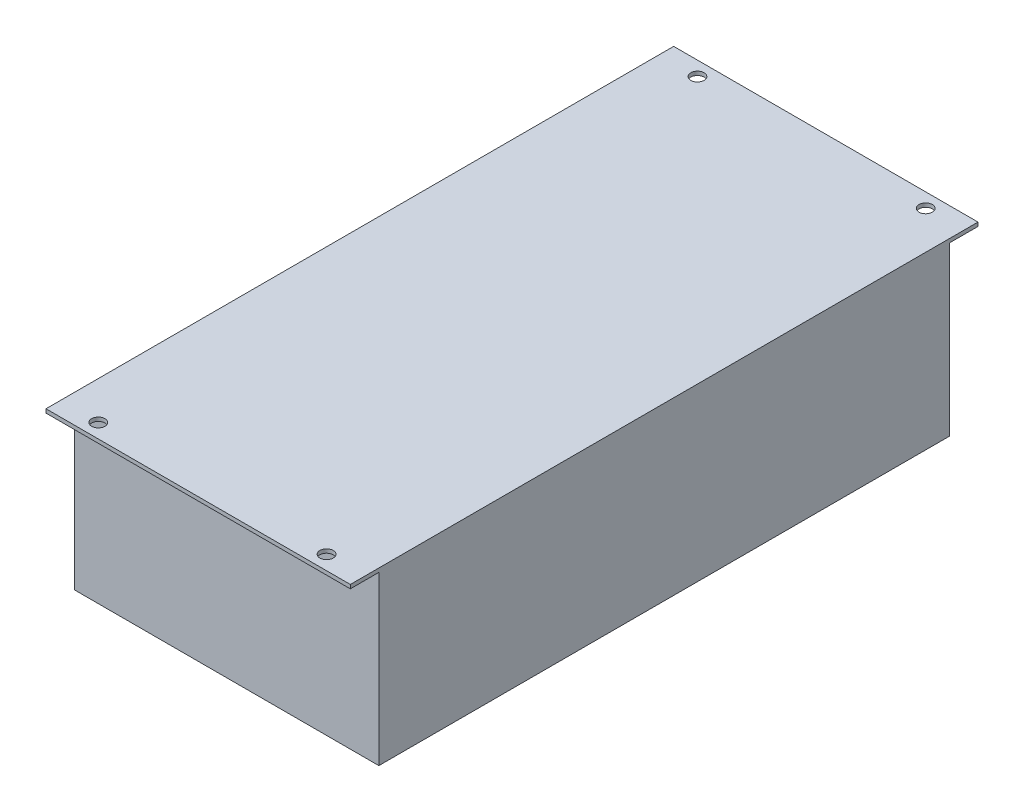
ISO-10303-21;
HEADER;
FILE_DESCRIPTION(('STEP AP214'),'2;1');
FILE_NAME('part.step','',(''),(''),'','','');
FILE_SCHEMA(('AUTOMOTIVE_DESIGN { 1 0 10303 214 1 1 1 1 }'));
ENDSEC;
DATA;
#1=APPLICATION_CONTEXT('core data for automotive mechanical design processes');
#2=APPLICATION_PROTOCOL_DEFINITION('international standard','automotive_design',2000,#1);
#3=PRODUCT_CONTEXT('',#1,'mechanical');
#4=PRODUCT('Part','Part','',(#3));
#5=PRODUCT_RELATED_PRODUCT_CATEGORY('part','',(#4));
#6=PRODUCT_DEFINITION_FORMATION('','',#4);
#7=PRODUCT_DEFINITION_CONTEXT('part definition',#1,'design');
#8=PRODUCT_DEFINITION('design','',#6,#7);
#9=PRODUCT_DEFINITION_SHAPE('','',#8);
#10=(LENGTH_UNIT() NAMED_UNIT(*) SI_UNIT(.MILLI.,.METRE.));
#11=(NAMED_UNIT(*) PLANE_ANGLE_UNIT() SI_UNIT($,.RADIAN.));
#12=(NAMED_UNIT(*) SI_UNIT($,.STERADIAN.) SOLID_ANGLE_UNIT());
#13=UNCERTAINTY_MEASURE_WITH_UNIT(LENGTH_MEASURE(1.E-05),#10,'distance_accuracy_value','');
#14=(GEOMETRIC_REPRESENTATION_CONTEXT(3) GLOBAL_UNCERTAINTY_ASSIGNED_CONTEXT((#13)) GLOBAL_UNIT_ASSIGNED_CONTEXT((#10,
#11,#12)) REPRESENTATION_CONTEXT('',''));
#15=CARTESIAN_POINT('',(0.,0.,0.));
#16=DIRECTION('',(0.,0.,1.));
#17=DIRECTION('',(1.,0.,0.));
#18=AXIS2_PLACEMENT_3D('',#15,#16,#17);
#19=CARTESIAN_POINT('',(80.,90.,150.));
#20=DIRECTION('',(0.,0.,1.));
#21=DIRECTION('',(1.,0.,0.));
#22=AXIS2_PLACEMENT_3D('',#19,#20,#21);
#23=PLANE('',#22);
#24=DIRECTION('',(0.,1.,0.));
#25=VECTOR('',#24,1.);
#26=CARTESIAN_POINT('',(80.,90.,150.));
#27=LINE('',#26,#25);
#28=CARTESIAN_POINT('',(80.,-15.,150.));
#29=VERTEX_POINT('',#28);
#30=CARTESIAN_POINT('',(80.,73.,150.));
#31=VERTEX_POINT('',#30);
#32=EDGE_CURVE('E153',#29,#31,#27,.T.);
#33=ORIENTED_EDGE('',*,*,#32,.T.);
#34=DIRECTION('',(-1.,0.,0.));
#35=VECTOR('',#34,1.);
#36=CARTESIAN_POINT('',(80.,73.,150.));
#37=LINE('',#36,#35);
#38=CARTESIAN_POINT('',(-80.,73.,150.));
#39=VERTEX_POINT('',#38);
#40=EDGE_CURVE('E103',#31,#39,#37,.T.);
#41=ORIENTED_EDGE('',*,*,#40,.T.);
#42=DIRECTION('',(0.,1.,0.));
#43=VECTOR('',#42,1.);
#44=CARTESIAN_POINT('',(-80.,90.,150.));
#45=LINE('',#44,#43);
#46=CARTESIAN_POINT('',(-80.,-15.,150.));
#47=VERTEX_POINT('',#46);
#48=EDGE_CURVE('E92',#47,#39,#45,.T.);
#49=ORIENTED_EDGE('',*,*,#48,.F.);
#50=DIRECTION('',(-1.,0.,0.));
#51=VECTOR('',#50,1.);
#52=CARTESIAN_POINT('',(0.,-15.,150.));
#53=LINE('',#52,#51);
#54=EDGE_CURVE('E135',#29,#47,#53,.T.);
#55=ORIENTED_EDGE('',*,*,#54,.F.);
#56=EDGE_LOOP('',(#33,#41,#49,#55));
#57=FACE_BOUND('',#56,.T.);
#58=ADVANCED_FACE('F20',(#57),#23,.T.);
#59=CARTESIAN_POINT('',(-80.,90.,-150.));
#60=DIRECTION('',(0.,0.,-1.));
#61=DIRECTION('',(-1.,0.,0.));
#62=AXIS2_PLACEMENT_3D('',#59,#60,#61);
#63=PLANE('',#62);
#64=DIRECTION('',(0.,1.,0.));
#65=VECTOR('',#64,1.);
#66=CARTESIAN_POINT('',(-80.,90.,-150.));
#67=LINE('',#66,#65);
#68=CARTESIAN_POINT('',(-80.,-15.,-150.));
#69=VERTEX_POINT('',#68);
#70=CARTESIAN_POINT('',(-80.,73.,-150.));
#71=VERTEX_POINT('',#70);
#72=EDGE_CURVE('E142',#69,#71,#67,.T.);
#73=ORIENTED_EDGE('',*,*,#72,.T.);
#74=DIRECTION('',(1.,0.,0.));
#75=VECTOR('',#74,1.);
#76=CARTESIAN_POINT('',(-80.,73.,-150.));
#77=LINE('',#76,#75);
#78=CARTESIAN_POINT('',(80.,73.,-150.));
#79=VERTEX_POINT('',#78);
#80=EDGE_CURVE('E121',#71,#79,#77,.T.);
#81=ORIENTED_EDGE('',*,*,#80,.T.);
#82=DIRECTION('',(0.,1.,0.));
#83=VECTOR('',#82,1.);
#84=CARTESIAN_POINT('',(80.,90.,-150.));
#85=LINE('',#84,#83);
#86=CARTESIAN_POINT('',(80.,-15.,-150.));
#87=VERTEX_POINT('',#86);
#88=EDGE_CURVE('E149',#87,#79,#85,.T.);
#89=ORIENTED_EDGE('',*,*,#88,.F.);
#90=DIRECTION('',(1.,0.,0.));
#91=VECTOR('',#90,1.);
#92=CARTESIAN_POINT('',(0.,-15.,-150.));
#93=LINE('',#92,#91);
#94=EDGE_CURVE('E152',#69,#87,#93,.T.);
#95=ORIENTED_EDGE('',*,*,#94,.F.);
#96=EDGE_LOOP('',(#73,#81,#89,#95));
#97=FACE_BOUND('',#96,.T.);
#98=ADVANCED_FACE('F214',(#97),#63,.T.);
#99=CARTESIAN_POINT('',(0.,75.,0.));
#100=DIRECTION('',(0.,-1.,0.));
#101=DIRECTION('',(0.,0.,-1.));
#102=AXIS2_PLACEMENT_3D('',#99,#100,#101);
#103=PLANE('',#102);
#104=CARTESIAN_POINT('',(60.,75.,157.5));
#105=DIRECTION('',(0.,-1.,0.));
#106=DIRECTION('',(0.,0.,-1.));
#107=AXIS2_PLACEMENT_3D('',#104,#105,#106);
#108=CIRCLE('',#107,3.5);
#109=CARTESIAN_POINT('',(60.,75.,154.));
#110=VERTEX_POINT('',#109);
#111=EDGE_CURVE('E188',#110,#110,#108,.T.);
#112=ORIENTED_EDGE('',*,*,#111,.T.);
#113=EDGE_LOOP('',(#112));
#114=FACE_BOUND('',#113,.T.);
#115=CARTESIAN_POINT('',(-60.,75.,157.5));
#116=DIRECTION('',(0.,-1.,0.));
#117=DIRECTION('',(0.,0.,-1.));
#118=AXIS2_PLACEMENT_3D('',#115,#116,#117);
#119=CIRCLE('',#118,3.5);
#120=CARTESIAN_POINT('',(-60.,75.,154.));
#121=VERTEX_POINT('',#120);
#122=EDGE_CURVE('E174',#121,#121,#119,.T.);
#123=ORIENTED_EDGE('',*,*,#122,.T.);
#124=EDGE_LOOP('',(#123));
#125=FACE_BOUND('',#124,.T.);
#126=CARTESIAN_POINT('',(-60.,75.,-157.5));
#127=DIRECTION('',(0.,-1.,0.));
#128=DIRECTION('',(0.,0.,1.));
#129=AXIS2_PLACEMENT_3D('',#126,#127,#128);
#130=CIRCLE('',#129,3.5);
#131=CARTESIAN_POINT('',(-60.,75.,-154.));
#132=VERTEX_POINT('',#131);
#133=EDGE_CURVE('E171',#132,#132,#130,.T.);
#134=ORIENTED_EDGE('',*,*,#133,.T.);
#135=EDGE_LOOP('',(#134));
#136=FACE_BOUND('',#135,.T.);
#137=CARTESIAN_POINT('',(60.,75.,-157.5));
#138=DIRECTION('',(0.,-1.,0.));
#139=DIRECTION('',(0.,0.,1.));
#140=AXIS2_PLACEMENT_3D('',#137,#138,#139);
#141=CIRCLE('',#140,3.5);
#142=CARTESIAN_POINT('',(60.,75.,-154.));
#143=VERTEX_POINT('',#142);
#144=EDGE_CURVE('E168',#143,#143,#141,.T.);
#145=ORIENTED_EDGE('',*,*,#144,.T.);
#146=EDGE_LOOP('',(#145));
#147=FACE_BOUND('',#146,.T.);
#148=DIRECTION('',(0.,0.,1.));
#149=VECTOR('',#148,1.);
#150=CARTESIAN_POINT('',(80.,75.,0.));
#151=LINE('',#150,#149);
#152=CARTESIAN_POINT('',(80.,75.,-165.));
#153=VERTEX_POINT('',#152);
#154=CARTESIAN_POINT('',(80.,75.,165.));
#155=VERTEX_POINT('',#154);
#156=EDGE_CURVE('E12',#153,#155,#151,.T.);
#157=ORIENTED_EDGE('',*,*,#156,.F.);
#158=DIRECTION('',(1.,0.,0.));
#159=VECTOR('',#158,1.);
#160=CARTESIAN_POINT('',(0.,75.,-165.));
#161=LINE('',#160,#159);
#162=CARTESIAN_POINT('',(-80.,75.,-165.));
#163=VERTEX_POINT('',#162);
#164=EDGE_CURVE('E130',#163,#153,#161,.T.);
#165=ORIENTED_EDGE('',*,*,#164,.F.);
#166=DIRECTION('',(0.,0.,-1.));
#167=VECTOR('',#166,1.);
#168=CARTESIAN_POINT('',(-80.,75.,0.));
#169=LINE('',#168,#167);
#170=CARTESIAN_POINT('',(-80.,75.,165.));
#171=VERTEX_POINT('',#170);
#172=EDGE_CURVE('E29',#171,#163,#169,.T.);
#173=ORIENTED_EDGE('',*,*,#172,.F.);
#174=DIRECTION('',(-1.,0.,0.));
#175=VECTOR('',#174,1.);
#176=CARTESIAN_POINT('',(0.,75.,165.));
#177=LINE('',#176,#175);
#178=EDGE_CURVE('E108',#171,#155,#177,.F.);
#179=ORIENTED_EDGE('',*,*,#178,.T.);
#180=EDGE_LOOP('',(#157,#165,#173,#179));
#181=FACE_BOUND('',#180,.T.);
#182=ADVANCED_FACE('F195',(#114,#125,#136,#147,#181),#103,.F.);
#183=CARTESIAN_POINT('',(-80.,90.,150.));
#184=DIRECTION('',(-1.,0.,0.));
#185=DIRECTION('',(0.,0.,1.));
#186=AXIS2_PLACEMENT_3D('',#183,#184,#185);
#187=PLANE('',#186);
#188=ORIENTED_EDGE('',*,*,#172,.T.);
#189=DIRECTION('',(0.,1.,0.));
#190=VECTOR('',#189,1.);
#191=CARTESIAN_POINT('',(-80.,90.,-165.));
#192=LINE('',#191,#190);
#193=CARTESIAN_POINT('',(-80.,73.,-165.));
#194=VERTEX_POINT('',#193);
#195=EDGE_CURVE('E126',#194,#163,#192,.T.);
#196=ORIENTED_EDGE('',*,*,#195,.F.);
#197=DIRECTION('',(0.,0.,1.));
#198=VECTOR('',#197,1.);
#199=CARTESIAN_POINT('',(-80.,73.,-165.));
#200=LINE('',#199,#198);
#201=EDGE_CURVE('E133',#194,#71,#200,.T.);
#202=ORIENTED_EDGE('',*,*,#201,.T.);
#203=ORIENTED_EDGE('',*,*,#72,.F.);
#204=DIRECTION('',(0.,0.,-1.));
#205=VECTOR('',#204,1.);
#206=CARTESIAN_POINT('',(-80.,-15.,0.));
#207=LINE('',#206,#205);
#208=EDGE_CURVE('E148',#47,#69,#207,.T.);
#209=ORIENTED_EDGE('',*,*,#208,.F.);
#210=ORIENTED_EDGE('',*,*,#48,.T.);
#211=DIRECTION('',(0.,0.,-1.));
#212=VECTOR('',#211,1.);
#213=CARTESIAN_POINT('',(-80.,73.,165.));
#214=LINE('',#213,#212);
#215=CARTESIAN_POINT('',(-80.,73.,165.));
#216=VERTEX_POINT('',#215);
#217=EDGE_CURVE('E37',#216,#39,#214,.T.);
#218=ORIENTED_EDGE('',*,*,#217,.F.);
#219=DIRECTION('',(0.,1.,0.));
#220=VECTOR('',#219,1.);
#221=CARTESIAN_POINT('',(-80.,90.,165.));
#222=LINE('',#221,#220);
#223=EDGE_CURVE('E90',#216,#171,#222,.T.);
#224=ORIENTED_EDGE('',*,*,#223,.T.);
#225=EDGE_LOOP('',(#188,#196,#202,#203,#209,#210,#218,#224));
#226=FACE_BOUND('',#225,.T.);
#227=ADVANCED_FACE('F88',(#226),#187,.T.);
#228=CARTESIAN_POINT('',(80.,90.,-150.));
#229=DIRECTION('',(1.,0.,0.));
#230=DIRECTION('',(0.,0.,-1.));
#231=AXIS2_PLACEMENT_3D('',#228,#229,#230);
#232=PLANE('',#231);
#233=ORIENTED_EDGE('',*,*,#88,.T.);
#234=DIRECTION('',(0.,0.,1.));
#235=VECTOR('',#234,1.);
#236=CARTESIAN_POINT('',(80.,73.,-165.));
#237=LINE('',#236,#235);
#238=CARTESIAN_POINT('',(80.,73.,-165.));
#239=VERTEX_POINT('',#238);
#240=EDGE_CURVE('E45',#239,#79,#237,.T.);
#241=ORIENTED_EDGE('',*,*,#240,.F.);
#242=DIRECTION('',(0.,1.,0.));
#243=VECTOR('',#242,1.);
#244=CARTESIAN_POINT('',(80.,90.,-165.));
#245=LINE('',#244,#243);
#246=EDGE_CURVE('E138',#239,#153,#245,.T.);
#247=ORIENTED_EDGE('',*,*,#246,.T.);
#248=ORIENTED_EDGE('',*,*,#156,.T.);
#249=DIRECTION('',(0.,-1.,0.));
#250=VECTOR('',#249,1.);
#251=CARTESIAN_POINT('',(80.,90.,165.));
#252=LINE('',#251,#250);
#253=CARTESIAN_POINT('',(80.,73.,165.));
#254=VERTEX_POINT('',#253);
#255=EDGE_CURVE('E102',#254,#155,#252,.F.);
#256=ORIENTED_EDGE('',*,*,#255,.F.);
#257=DIRECTION('',(0.,0.,1.));
#258=VECTOR('',#257,1.);
#259=CARTESIAN_POINT('',(80.,73.,165.));
#260=LINE('',#259,#258);
#261=EDGE_CURVE('E93',#254,#31,#260,.F.);
#262=ORIENTED_EDGE('',*,*,#261,.T.);
#263=ORIENTED_EDGE('',*,*,#32,.F.);
#264=DIRECTION('',(0.,0.,-1.));
#265=VECTOR('',#264,1.);
#266=CARTESIAN_POINT('',(80.,-15.,-150.));
#267=LINE('',#266,#265);
#268=EDGE_CURVE('E156',#29,#87,#267,.T.);
#269=ORIENTED_EDGE('',*,*,#268,.T.);
#270=EDGE_LOOP('',(#233,#241,#247,#248,#256,#262,#263,#269));
#271=FACE_BOUND('',#270,.T.);
#272=ADVANCED_FACE('F224',(#271),#232,.T.);
#273=CARTESIAN_POINT('',(0.,-15.,0.));
#274=DIRECTION('',(0.,-1.,0.));
#275=DIRECTION('',(0.,0.,-1.));
#276=AXIS2_PLACEMENT_3D('',#273,#274,#275);
#277=PLANE('',#276);
#278=ORIENTED_EDGE('',*,*,#94,.T.);
#279=ORIENTED_EDGE('',*,*,#268,.F.);
#280=ORIENTED_EDGE('',*,*,#54,.T.);
#281=ORIENTED_EDGE('',*,*,#208,.T.);
#282=EDGE_LOOP('',(#278,#279,#280,#281));
#283=FACE_BOUND('',#282,.T.);
#284=ADVANCED_FACE('F22',(#283),#277,.T.);
#285=CARTESIAN_POINT('',(-80.,73.,-165.));
#286=DIRECTION('',(0.,-1.,0.));
#287=DIRECTION('',(1.,0.,0.));
#288=AXIS2_PLACEMENT_3D('',#285,#286,#287);
#289=PLANE('',#288);
#290=CARTESIAN_POINT('',(-60.,73.,-157.5));
#291=DIRECTION('',(0.,-1.,0.));
#292=DIRECTION('',(1.,0.,0.));
#293=AXIS2_PLACEMENT_3D('',#290,#291,#292);
#294=CIRCLE('',#293,3.5);
#295=CARTESIAN_POINT('',(-56.5,73.,-157.5));
#296=VERTEX_POINT('',#295);
#297=EDGE_CURVE('E169',#296,#296,#294,.F.);
#298=ORIENTED_EDGE('',*,*,#297,.T.);
#299=EDGE_LOOP('',(#298));
#300=FACE_BOUND('',#299,.T.);
#301=CARTESIAN_POINT('',(60.,73.,-157.5));
#302=DIRECTION('',(0.,-1.,0.));
#303=DIRECTION('',(1.,0.,0.));
#304=AXIS2_PLACEMENT_3D('',#301,#302,#303);
#305=CIRCLE('',#304,3.5);
#306=CARTESIAN_POINT('',(63.5,73.,-157.5));
#307=VERTEX_POINT('',#306);
#308=EDGE_CURVE('E118',#307,#307,#305,.F.);
#309=ORIENTED_EDGE('',*,*,#308,.T.);
#310=EDGE_LOOP('',(#309));
#311=FACE_BOUND('',#310,.T.);
#312=ORIENTED_EDGE('',*,*,#80,.F.);
#313=ORIENTED_EDGE('',*,*,#201,.F.);
#314=DIRECTION('',(1.,0.,0.));
#315=VECTOR('',#314,1.);
#316=CARTESIAN_POINT('',(-80.,73.,-165.));
#317=LINE('',#316,#315);
#318=EDGE_CURVE('E123',#194,#239,#317,.T.);
#319=ORIENTED_EDGE('',*,*,#318,.T.);
#320=ORIENTED_EDGE('',*,*,#240,.T.);
#321=EDGE_LOOP('',(#312,#313,#319,#320));
#322=FACE_BOUND('',#321,.T.);
#323=ADVANCED_FACE('F258',(#300,#311,#322),#289,.T.);
#324=CARTESIAN_POINT('',(-80.,90.,-165.));
#325=DIRECTION('',(0.,0.,-1.));
#326=DIRECTION('',(-1.,0.,0.));
#327=AXIS2_PLACEMENT_3D('',#324,#325,#326);
#328=PLANE('',#327);
#329=ORIENTED_EDGE('',*,*,#318,.F.);
#330=ORIENTED_EDGE('',*,*,#195,.T.);
#331=ORIENTED_EDGE('',*,*,#164,.T.);
#332=ORIENTED_EDGE('',*,*,#246,.F.);
#333=EDGE_LOOP('',(#329,#330,#331,#332));
#334=FACE_BOUND('',#333,.T.);
#335=ADVANCED_FACE('F253',(#334),#328,.T.);
#336=CARTESIAN_POINT('',(80.,73.,165.));
#337=DIRECTION('',(0.,-1.,0.));
#338=DIRECTION('',(0.,0.,-1.));
#339=AXIS2_PLACEMENT_3D('',#336,#337,#338);
#340=PLANE('',#339);
#341=CARTESIAN_POINT('',(60.,73.,157.5));
#342=DIRECTION('',(0.,-1.,0.));
#343=DIRECTION('',(0.,0.,-1.));
#344=AXIS2_PLACEMENT_3D('',#341,#342,#343);
#345=CIRCLE('',#344,3.5);
#346=CARTESIAN_POINT('',(60.,73.,154.));
#347=VERTEX_POINT('',#346);
#348=EDGE_CURVE('E24',#347,#347,#345,.F.);
#349=ORIENTED_EDGE('',*,*,#348,.T.);
#350=EDGE_LOOP('',(#349));
#351=FACE_BOUND('',#350,.T.);
#352=CARTESIAN_POINT('',(-60.,73.,157.5));
#353=DIRECTION('',(0.,-1.,0.));
#354=DIRECTION('',(0.,0.,-1.));
#355=AXIS2_PLACEMENT_3D('',#352,#353,#354);
#356=CIRCLE('',#355,3.5);
#357=CARTESIAN_POINT('',(-60.,73.,154.));
#358=VERTEX_POINT('',#357);
#359=EDGE_CURVE('E172',#358,#358,#356,.F.);
#360=ORIENTED_EDGE('',*,*,#359,.T.);
#361=EDGE_LOOP('',(#360));
#362=FACE_BOUND('',#361,.T.);
#363=ORIENTED_EDGE('',*,*,#40,.F.);
#364=ORIENTED_EDGE('',*,*,#261,.F.);
#365=DIRECTION('',(-1.,0.,0.));
#366=VECTOR('',#365,1.);
#367=CARTESIAN_POINT('',(80.,73.,165.));
#368=LINE('',#367,#366);
#369=EDGE_CURVE('E96',#254,#216,#368,.T.);
#370=ORIENTED_EDGE('',*,*,#369,.T.);
#371=ORIENTED_EDGE('',*,*,#217,.T.);
#372=EDGE_LOOP('',(#363,#364,#370,#371));
#373=FACE_BOUND('',#372,.T.);
#374=ADVANCED_FACE('F97',(#351,#362,#373),#340,.T.);
#375=CARTESIAN_POINT('',(80.,90.,165.));
#376=DIRECTION('',(0.,0.,1.));
#377=DIRECTION('',(1.,0.,0.));
#378=AXIS2_PLACEMENT_3D('',#375,#376,#377);
#379=PLANE('',#378);
#380=ORIENTED_EDGE('',*,*,#369,.F.);
#381=ORIENTED_EDGE('',*,*,#255,.T.);
#382=ORIENTED_EDGE('',*,*,#178,.F.);
#383=ORIENTED_EDGE('',*,*,#223,.F.);
#384=EDGE_LOOP('',(#380,#381,#382,#383));
#385=FACE_BOUND('',#384,.T.);
#386=ADVANCED_FACE('F106',(#385),#379,.T.);
#387=CARTESIAN_POINT('',(60.,46.9153683235405,-157.5));
#388=DIRECTION('',(0.,1.,0.));
#389=DIRECTION('',(0.,0.,1.));
#390=AXIS2_PLACEMENT_3D('',#387,#388,#389);
#391=CYLINDRICAL_SURFACE('',#390,3.5);
#392=ORIENTED_EDGE('',*,*,#308,.F.);
#393=EDGE_LOOP('',(#392));
#394=FACE_BOUND('',#393,.T.);
#395=ORIENTED_EDGE('',*,*,#144,.F.);
#396=EDGE_LOOP('',(#395));
#397=FACE_BOUND('',#396,.T.);
#398=ADVANCED_FACE('F198',(#394,#397),#391,.F.);
#399=CARTESIAN_POINT('',(-60.,46.9153683235405,-157.5));
#400=DIRECTION('',(0.,1.,0.));
#401=DIRECTION('',(0.,0.,1.));
#402=AXIS2_PLACEMENT_3D('',#399,#400,#401);
#403=CYLINDRICAL_SURFACE('',#402,3.5);
#404=ORIENTED_EDGE('',*,*,#297,.F.);
#405=EDGE_LOOP('',(#404));
#406=FACE_BOUND('',#405,.T.);
#407=ORIENTED_EDGE('',*,*,#133,.F.);
#408=EDGE_LOOP('',(#407));
#409=FACE_BOUND('',#408,.T.);
#410=ADVANCED_FACE('F200',(#406,#409),#403,.F.);
#411=CARTESIAN_POINT('',(-60.,46.9153683235405,157.5));
#412=DIRECTION('',(0.,1.,0.));
#413=DIRECTION('',(0.,0.,1.));
#414=AXIS2_PLACEMENT_3D('',#411,#412,#413);
#415=CYLINDRICAL_SURFACE('',#414,3.5);
#416=ORIENTED_EDGE('',*,*,#359,.F.);
#417=EDGE_LOOP('',(#416));
#418=FACE_BOUND('',#417,.T.);
#419=ORIENTED_EDGE('',*,*,#122,.F.);
#420=EDGE_LOOP('',(#419));
#421=FACE_BOUND('',#420,.T.);
#422=ADVANCED_FACE('F208',(#418,#421),#415,.F.);
#423=CARTESIAN_POINT('',(60.,46.9153683235405,157.5));
#424=DIRECTION('',(0.,1.,0.));
#425=DIRECTION('',(0.,0.,1.));
#426=AXIS2_PLACEMENT_3D('',#423,#424,#425);
#427=CYLINDRICAL_SURFACE('',#426,3.5);
#428=ORIENTED_EDGE('',*,*,#348,.F.);
#429=EDGE_LOOP('',(#428));
#430=FACE_BOUND('',#429,.T.);
#431=ORIENTED_EDGE('',*,*,#111,.F.);
#432=EDGE_LOOP('',(#431));
#433=FACE_BOUND('',#432,.T.);
#434=ADVANCED_FACE('F241',(#430,#433),#427,.F.);
#435=CLOSED_SHELL('',(#58,#98,#182,#227,#272,#284,#323,#335,#374,#386,#398,#410,#422,#434));
#436=MANIFOLD_SOLID_BREP('B1',#435);
#437=ADVANCED_BREP_SHAPE_REPRESENTATION('',(#18,#436),#14);
#438=SHAPE_DEFINITION_REPRESENTATION(#9,#437);
ENDSEC;
END-ISO-10303-21;
